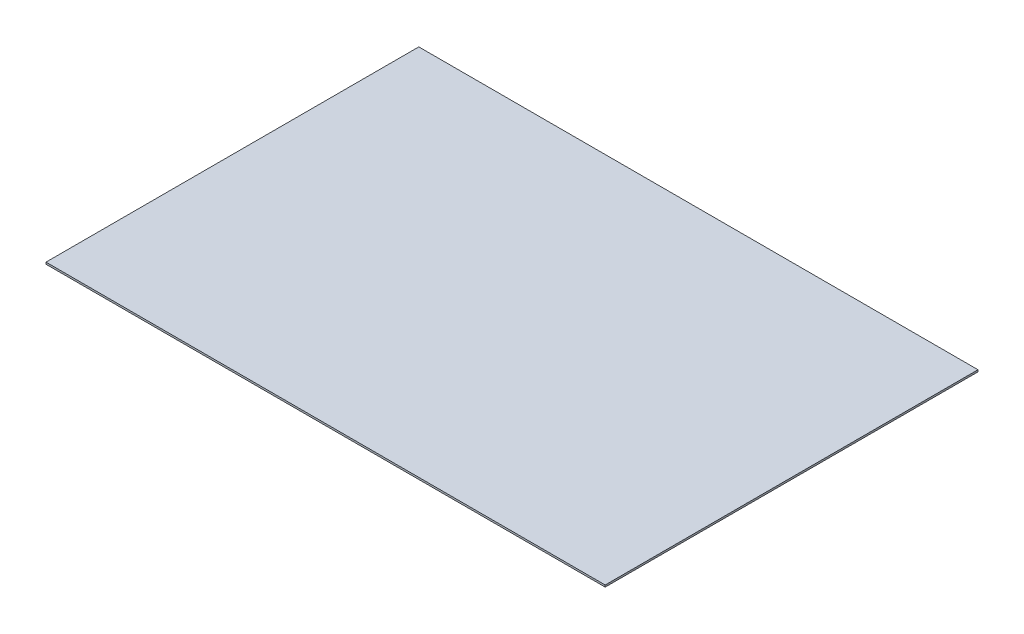
ISO-10303-21;
HEADER;
FILE_DESCRIPTION(('STEP AP214'),'2;1');
FILE_NAME('part.step','',(''),(''),'','','');
FILE_SCHEMA(('AUTOMOTIVE_DESIGN { 1 0 10303 214 1 1 1 1 }'));
ENDSEC;
DATA;
#1=APPLICATION_CONTEXT('core data for automotive mechanical design processes');
#2=APPLICATION_PROTOCOL_DEFINITION('international standard','automotive_design',2000,#1);
#3=PRODUCT_CONTEXT('',#1,'mechanical');
#4=PRODUCT('Part','Part','',(#3));
#5=PRODUCT_RELATED_PRODUCT_CATEGORY('part','',(#4));
#6=PRODUCT_DEFINITION_FORMATION('','',#4);
#7=PRODUCT_DEFINITION_CONTEXT('part definition',#1,'design');
#8=PRODUCT_DEFINITION('design','',#6,#7);
#9=PRODUCT_DEFINITION_SHAPE('','',#8);
#10=(LENGTH_UNIT() NAMED_UNIT(*) SI_UNIT(.MILLI.,.METRE.));
#11=(NAMED_UNIT(*) PLANE_ANGLE_UNIT() SI_UNIT($,.RADIAN.));
#12=(NAMED_UNIT(*) SI_UNIT($,.STERADIAN.) SOLID_ANGLE_UNIT());
#13=UNCERTAINTY_MEASURE_WITH_UNIT(LENGTH_MEASURE(1.E-05),#10,'distance_accuracy_value','');
#14=(GEOMETRIC_REPRESENTATION_CONTEXT(3) GLOBAL_UNCERTAINTY_ASSIGNED_CONTEXT((#13)) GLOBAL_UNIT_ASSIGNED_CONTEXT((#10,
#11,#12)) REPRESENTATION_CONTEXT('',''));
#15=CARTESIAN_POINT('',(0.,0.,0.));
#16=DIRECTION('',(0.,0.,1.));
#17=DIRECTION('',(1.,0.,0.));
#18=AXIS2_PLACEMENT_3D('',#15,#16,#17);
#19=CARTESIAN_POINT('',(750.,5.,500.));
#20=DIRECTION('',(-1.,0.,0.));
#21=DIRECTION('',(0.,0.,1.));
#22=AXIS2_PLACEMENT_3D('',#19,#20,#21);
#23=PLANE('',#22);
#24=DIRECTION('',(0.,0.,-1.));
#25=VECTOR('',#24,1.);
#26=CARTESIAN_POINT('',(750.,0.,500.));
#27=LINE('',#26,#25);
#28=CARTESIAN_POINT('',(750.,0.,500.));
#29=VERTEX_POINT('',#28);
#30=CARTESIAN_POINT('',(750.,0.,-500.));
#31=VERTEX_POINT('',#30);
#32=EDGE_CURVE('E107',#29,#31,#27,.T.);
#33=ORIENTED_EDGE('',*,*,#32,.T.);
#34=DIRECTION('',(0.,-1.,0.));
#35=VECTOR('',#34,1.);
#36=CARTESIAN_POINT('',(750.,5.,-500.));
#37=LINE('',#36,#35);
#38=CARTESIAN_POINT('',(750.,5.,-500.));
#39=VERTEX_POINT('',#38);
#40=EDGE_CURVE('E11',#39,#31,#37,.T.);
#41=ORIENTED_EDGE('',*,*,#40,.F.);
#42=DIRECTION('',(0.,0.,-1.));
#43=VECTOR('',#42,1.);
#44=CARTESIAN_POINT('',(750.,5.,500.));
#45=LINE('',#44,#43);
#46=CARTESIAN_POINT('',(750.,5.,500.));
#47=VERTEX_POINT('',#46);
#48=EDGE_CURVE('E91',#47,#39,#45,.T.);
#49=ORIENTED_EDGE('',*,*,#48,.F.);
#50=DIRECTION('',(0.,-1.,0.));
#51=VECTOR('',#50,1.);
#52=CARTESIAN_POINT('',(750.,5.,500.));
#53=LINE('',#52,#51);
#54=EDGE_CURVE('E103',#47,#29,#53,.T.);
#55=ORIENTED_EDGE('',*,*,#54,.T.);
#56=EDGE_LOOP('',(#33,#41,#49,#55));
#57=FACE_BOUND('',#56,.T.);
#58=ADVANCED_FACE('F39',(#57),#23,.F.);
#59=CARTESIAN_POINT('',(-750.,5.,-500.));
#60=DIRECTION('',(0.,0.,1.));
#61=DIRECTION('',(1.,0.,0.));
#62=AXIS2_PLACEMENT_3D('',#59,#60,#61);
#63=PLANE('',#62);
#64=DIRECTION('',(-1.,0.,0.));
#65=VECTOR('',#64,1.);
#66=CARTESIAN_POINT('',(-750.,0.,-500.));
#67=LINE('',#66,#65);
#68=CARTESIAN_POINT('',(-750.,0.,-500.));
#69=VERTEX_POINT('',#68);
#70=EDGE_CURVE('E96',#31,#69,#67,.T.);
#71=ORIENTED_EDGE('',*,*,#70,.T.);
#72=DIRECTION('',(0.,-1.,0.));
#73=VECTOR('',#72,1.);
#74=CARTESIAN_POINT('',(-750.,5.,-500.));
#75=LINE('',#74,#73);
#76=CARTESIAN_POINT('',(-750.,5.,-500.));
#77=VERTEX_POINT('',#76);
#78=EDGE_CURVE('E48',#77,#69,#75,.T.);
#79=ORIENTED_EDGE('',*,*,#78,.F.);
#80=DIRECTION('',(-1.,0.,0.));
#81=VECTOR('',#80,1.);
#82=CARTESIAN_POINT('',(-750.,5.,-500.));
#83=LINE('',#82,#81);
#84=EDGE_CURVE('E86',#39,#77,#83,.T.);
#85=ORIENTED_EDGE('',*,*,#84,.F.);
#86=ORIENTED_EDGE('',*,*,#40,.T.);
#87=EDGE_LOOP('',(#71,#79,#85,#86));
#88=FACE_BOUND('',#87,.T.);
#89=ADVANCED_FACE('F95',(#88),#63,.F.);
#90=CARTESIAN_POINT('',(-750.,5.,500.));
#91=DIRECTION('',(1.,0.,0.));
#92=DIRECTION('',(0.,0.,-1.));
#93=AXIS2_PLACEMENT_3D('',#90,#91,#92);
#94=PLANE('',#93);
#95=DIRECTION('',(0.,0.,1.));
#96=VECTOR('',#95,1.);
#97=CARTESIAN_POINT('',(-750.,0.,500.));
#98=LINE('',#97,#96);
#99=CARTESIAN_POINT('',(-750.,0.,500.));
#100=VERTEX_POINT('',#99);
#101=EDGE_CURVE('E73',#69,#100,#98,.T.);
#102=ORIENTED_EDGE('',*,*,#101,.T.);
#103=DIRECTION('',(0.,-1.,0.));
#104=VECTOR('',#103,1.);
#105=CARTESIAN_POINT('',(-750.,5.,500.));
#106=LINE('',#105,#104);
#107=CARTESIAN_POINT('',(-750.,5.,500.));
#108=VERTEX_POINT('',#107);
#109=EDGE_CURVE('E98',#108,#100,#106,.T.);
#110=ORIENTED_EDGE('',*,*,#109,.F.);
#111=DIRECTION('',(0.,0.,1.));
#112=VECTOR('',#111,1.);
#113=CARTESIAN_POINT('',(-750.,5.,500.));
#114=LINE('',#113,#112);
#115=EDGE_CURVE('E89',#77,#108,#114,.T.);
#116=ORIENTED_EDGE('',*,*,#115,.F.);
#117=ORIENTED_EDGE('',*,*,#78,.T.);
#118=EDGE_LOOP('',(#102,#110,#116,#117));
#119=FACE_BOUND('',#118,.T.);
#120=ADVANCED_FACE('F99',(#119),#94,.F.);
#121=CARTESIAN_POINT('',(-750.,5.,500.));
#122=DIRECTION('',(0.,0.,-1.));
#123=DIRECTION('',(-1.,0.,0.));
#124=AXIS2_PLACEMENT_3D('',#121,#122,#123);
#125=PLANE('',#124);
#126=DIRECTION('',(1.,0.,0.));
#127=VECTOR('',#126,1.);
#128=CARTESIAN_POINT('',(-750.,0.,500.));
#129=LINE('',#128,#127);
#130=EDGE_CURVE('E79',#100,#29,#129,.T.);
#131=ORIENTED_EDGE('',*,*,#130,.T.);
#132=ORIENTED_EDGE('',*,*,#54,.F.);
#133=DIRECTION('',(1.,0.,0.));
#134=VECTOR('',#133,1.);
#135=CARTESIAN_POINT('',(-750.,5.,500.));
#136=LINE('',#135,#134);
#137=EDGE_CURVE('E56',#108,#47,#136,.T.);
#138=ORIENTED_EDGE('',*,*,#137,.F.);
#139=ORIENTED_EDGE('',*,*,#109,.T.);
#140=EDGE_LOOP('',(#131,#132,#138,#139));
#141=FACE_BOUND('',#140,.T.);
#142=ADVANCED_FACE('F120',(#141),#125,.F.);
#143=CARTESIAN_POINT('',(0.,5.,0.));
#144=DIRECTION('',(0.,-1.,0.));
#145=DIRECTION('',(0.,0.,-1.));
#146=AXIS2_PLACEMENT_3D('',#143,#144,#145);
#147=PLANE('',#146);
#148=ORIENTED_EDGE('',*,*,#48,.T.);
#149=ORIENTED_EDGE('',*,*,#84,.T.);
#150=ORIENTED_EDGE('',*,*,#115,.T.);
#151=ORIENTED_EDGE('',*,*,#137,.T.);
#152=EDGE_LOOP('',(#148,#149,#150,#151));
#153=FACE_BOUND('',#152,.T.);
#154=ADVANCED_FACE('F87',(#153),#147,.F.);
#155=CARTESIAN_POINT('',(0.,0.,0.));
#156=DIRECTION('',(0.,-1.,0.));
#157=DIRECTION('',(0.,0.,-1.));
#158=AXIS2_PLACEMENT_3D('',#155,#156,#157);
#159=PLANE('',#158);
#160=ORIENTED_EDGE('',*,*,#32,.F.);
#161=ORIENTED_EDGE('',*,*,#130,.F.);
#162=ORIENTED_EDGE('',*,*,#101,.F.);
#163=ORIENTED_EDGE('',*,*,#70,.F.);
#164=EDGE_LOOP('',(#160,#161,#162,#163));
#165=FACE_BOUND('',#164,.T.);
#166=ADVANCED_FACE('F123',(#165),#159,.T.);
#167=CLOSED_SHELL('',(#58,#89,#120,#142,#154,#166));
#168=MANIFOLD_SOLID_BREP('B2',#167);
#169=ADVANCED_BREP_SHAPE_REPRESENTATION('',(#18,#168),#14);
#170=SHAPE_DEFINITION_REPRESENTATION(#9,#169);
ENDSEC;
END-ISO-10303-21;
